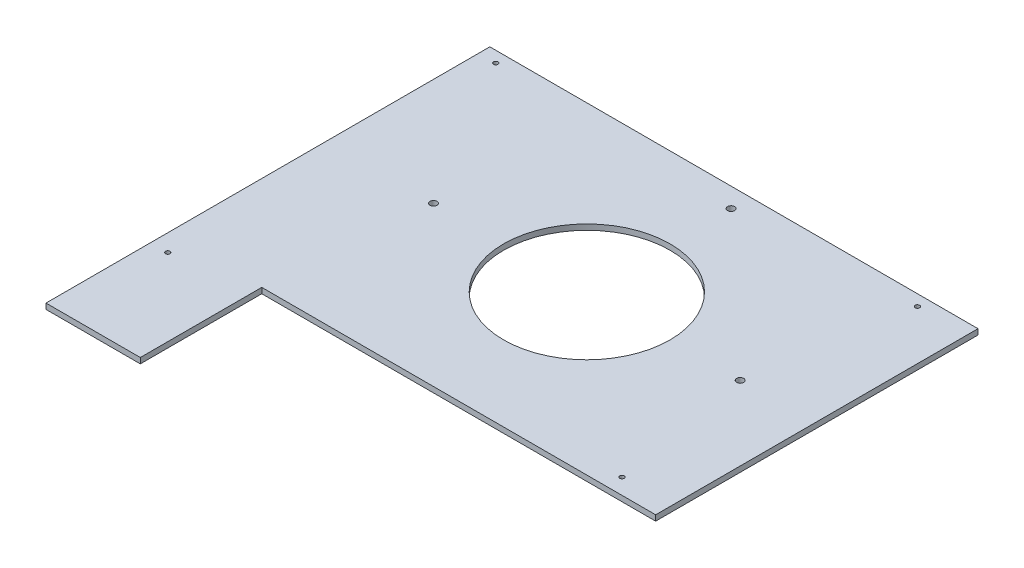
ISO-10303-21;
HEADER;
FILE_DESCRIPTION(('STEP AP214'),'2;1');
FILE_NAME('part.step','',(''),(''),'','','');
FILE_SCHEMA(('AUTOMOTIVE_DESIGN { 1 0 10303 214 1 1 1 1 }'));
ENDSEC;
DATA;
#1=APPLICATION_CONTEXT('core data for automotive mechanical design processes');
#2=APPLICATION_PROTOCOL_DEFINITION('international standard','automotive_design',2000,#1);
#3=PRODUCT_CONTEXT('',#1,'mechanical');
#4=PRODUCT('Part','Part','',(#3));
#5=PRODUCT_RELATED_PRODUCT_CATEGORY('part','',(#4));
#6=PRODUCT_DEFINITION_FORMATION('','',#4);
#7=PRODUCT_DEFINITION_CONTEXT('part definition',#1,'design');
#8=PRODUCT_DEFINITION('design','',#6,#7);
#9=PRODUCT_DEFINITION_SHAPE('','',#8);
#10=(LENGTH_UNIT() NAMED_UNIT(*) SI_UNIT(.MILLI.,.METRE.));
#11=(NAMED_UNIT(*) PLANE_ANGLE_UNIT() SI_UNIT($,.RADIAN.));
#12=(NAMED_UNIT(*) SI_UNIT($,.STERADIAN.) SOLID_ANGLE_UNIT());
#13=UNCERTAINTY_MEASURE_WITH_UNIT(LENGTH_MEASURE(1.E-05),#10,'distance_accuracy_value','');
#14=(GEOMETRIC_REPRESENTATION_CONTEXT(3) GLOBAL_UNCERTAINTY_ASSIGNED_CONTEXT((#13)) GLOBAL_UNIT_ASSIGNED_CONTEXT((#10,
#11,#12)) REPRESENTATION_CONTEXT('',''));
#15=CARTESIAN_POINT('',(0.,0.,0.));
#16=DIRECTION('',(0.,0.,1.));
#17=DIRECTION('',(1.,0.,0.));
#18=AXIS2_PLACEMENT_3D('',#15,#16,#17);
#19=CARTESIAN_POINT('',(0.,5.,0.));
#20=DIRECTION('',(0.,-1.,0.));
#21=DIRECTION('',(0.,0.,-1.));
#22=AXIS2_PLACEMENT_3D('',#19,#20,#21);
#23=PLANE('',#22);
#24=DIRECTION('',(1.,0.,0.));
#25=VECTOR('',#24,1.);
#26=CARTESIAN_POINT('',(-79.0240692738557,5.,112.958468136333));
#27=LINE('',#26,#25);
#28=CARTESIAN_POINT('',(-79.0240692738557,5.,112.958468136333));
#29=VERTEX_POINT('',#28);
#30=CARTESIAN_POINT('',(275.975930726144,5.,112.958468136333));
#31=VERTEX_POINT('',#30);
#32=EDGE_CURVE('E132',#29,#31,#27,.T.);
#33=ORIENTED_EDGE('',*,*,#32,.T.);
#34=DIRECTION('',(0.,0.,-1.));
#35=VECTOR('',#34,1.);
#36=CARTESIAN_POINT('',(275.975930726144,5.,-177.56894216173));
#37=LINE('',#36,#35);
#38=CARTESIAN_POINT('',(275.975930726144,5.,-177.56894216173));
#39=VERTEX_POINT('',#38);
#40=EDGE_CURVE('E86',#31,#39,#37,.T.);
#41=ORIENTED_EDGE('',*,*,#40,.T.);
#42=DIRECTION('',(-1.,0.,0.));
#43=VECTOR('',#42,1.);
#44=CARTESIAN_POINT('',(275.975930726144,5.,-177.56894216173));
#45=LINE('',#44,#43);
#46=CARTESIAN_POINT('',(-164.024069273856,5.,-177.56894216173));
#47=VERTEX_POINT('',#46);
#48=EDGE_CURVE('E100',#39,#47,#45,.T.);
#49=ORIENTED_EDGE('',*,*,#48,.T.);
#50=DIRECTION('',(0.,0.,1.));
#51=VECTOR('',#50,1.);
#52=CARTESIAN_POINT('',(-164.024069273856,5.,-177.56894216173));
#53=LINE('',#52,#51);
#54=CARTESIAN_POINT('',(-164.024069273856,5.,222.426710105648));
#55=VERTEX_POINT('',#54);
#56=EDGE_CURVE('E93',#47,#55,#53,.T.);
#57=ORIENTED_EDGE('',*,*,#56,.T.);
#58=DIRECTION('',(1.,0.,0.));
#59=VECTOR('',#58,1.);
#60=CARTESIAN_POINT('',(-164.024069273856,5.,222.426710105648));
#61=LINE('',#60,#59);
#62=CARTESIAN_POINT('',(-79.0240692738557,5.,222.426710105648));
#63=VERTEX_POINT('',#62);
#64=EDGE_CURVE('E97',#55,#63,#61,.T.);
#65=ORIENTED_EDGE('',*,*,#64,.T.);
#66=DIRECTION('',(0.,0.,-1.));
#67=VECTOR('',#66,1.);
#68=CARTESIAN_POINT('',(-79.0240692738557,5.,222.426710105648));
#69=LINE('',#68,#67);
#70=EDGE_CURVE('E51',#63,#29,#69,.T.);
#71=ORIENTED_EDGE('',*,*,#70,.T.);
#72=EDGE_LOOP('',(#33,#41,#49,#57,#65,#71));
#73=FACE_BOUND('',#72,.T.);
#74=CARTESIAN_POINT('',(-148.613055050861,5.,-167.56894216173));
#75=DIRECTION('',(0.,1.,0.));
#76=DIRECTION('',(0.,0.,1.));
#77=AXIS2_PLACEMENT_3D('',#74,#75,#76);
#78=CIRCLE('',#77,2.);
#79=CARTESIAN_POINT('',(-148.613055050861,5.,-165.56894216173));
#80=VERTEX_POINT('',#79);
#81=EDGE_CURVE('E123',#80,#80,#78,.T.);
#82=ORIENTED_EDGE('',*,*,#81,.F.);
#83=EDGE_LOOP('',(#82));
#84=FACE_BOUND('',#83,.T.);
#85=CARTESIAN_POINT('',(-148.613055050861,5.,128.145081947049));
#86=DIRECTION('',(0.,1.,0.));
#87=DIRECTION('',(0.,0.,1.));
#88=AXIS2_PLACEMENT_3D('',#85,#86,#87);
#89=CIRCLE('',#88,2.);
#90=CARTESIAN_POINT('',(-148.613055050861,5.,130.145081947049));
#91=VERTEX_POINT('',#90);
#92=EDGE_CURVE('E151',#91,#91,#89,.T.);
#93=ORIENTED_EDGE('',*,*,#92,.F.);
#94=EDGE_LOOP('',(#93));
#95=FACE_BOUND('',#94,.T.);
#96=CARTESIAN_POINT('',(231.386944949139,5.,98.6724922451126));
#97=DIRECTION('',(0.,1.,0.));
#98=DIRECTION('',(0.,0.,1.));
#99=AXIS2_PLACEMENT_3D('',#96,#97,#98);
#100=CIRCLE('',#99,2.);
#101=CARTESIAN_POINT('',(231.386944949139,5.,100.672492245113));
#102=VERTEX_POINT('',#101);
#103=EDGE_CURVE('E157',#102,#102,#100,.T.);
#104=ORIENTED_EDGE('',*,*,#103,.F.);
#105=EDGE_LOOP('',(#104));
#106=FACE_BOUND('',#105,.T.);
#107=CARTESIAN_POINT('',(231.386944949139,5.,-167.56894216173));
#108=DIRECTION('',(0.,1.,0.));
#109=DIRECTION('',(0.,0.,1.));
#110=AXIS2_PLACEMENT_3D('',#107,#108,#109);
#111=CIRCLE('',#110,2.);
#112=CARTESIAN_POINT('',(231.386944949139,5.,-165.56894216173));
#113=VERTEX_POINT('',#112);
#114=EDGE_CURVE('E163',#113,#113,#111,.T.);
#115=ORIENTED_EDGE('',*,*,#114,.F.);
#116=EDGE_LOOP('',(#115));
#117=FACE_BOUND('',#116,.T.);
#118=CARTESIAN_POINT('',(70.9759307261443,5.,-30.0257980897461));
#119=DIRECTION('',(0.,1.,0.));
#120=DIRECTION('',(0.,0.,1.));
#121=AXIS2_PLACEMENT_3D('',#118,#119,#120);
#122=CIRCLE('',#121,75.);
#123=CARTESIAN_POINT('',(70.9759307261443,5.,44.974201910254));
#124=VERTEX_POINT('',#123);
#125=EDGE_CURVE('E169',#124,#124,#122,.T.);
#126=ORIENTED_EDGE('',*,*,#125,.F.);
#127=EDGE_LOOP('',(#126));
#128=FACE_BOUND('',#127,.T.);
#129=CARTESIAN_POINT('',(70.9759307261443,5.,-160.025798089746));
#130=DIRECTION('',(0.,1.,0.));
#131=DIRECTION('',(0.,0.,1.));
#132=AXIS2_PLACEMENT_3D('',#129,#130,#131);
#133=CIRCLE('',#132,3.175);
#134=CARTESIAN_POINT('',(70.9759307261443,5.,-156.850798089746));
#135=VERTEX_POINT('',#134);
#136=EDGE_CURVE('E175',#135,#135,#133,.T.);
#137=ORIENTED_EDGE('',*,*,#136,.F.);
#138=EDGE_LOOP('',(#137));
#139=FACE_BOUND('',#138,.T.);
#140=CARTESIAN_POINT('',(209.175930726144,5.,-30.0257980897461));
#141=DIRECTION('',(0.,1.,0.));
#142=DIRECTION('',(0.,0.,1.));
#143=AXIS2_PLACEMENT_3D('',#140,#141,#142);
#144=CIRCLE('',#143,3.175);
#145=CARTESIAN_POINT('',(209.175930726144,5.,-26.8507980897461));
#146=VERTEX_POINT('',#145);
#147=EDGE_CURVE('E181',#146,#146,#144,.T.);
#148=ORIENTED_EDGE('',*,*,#147,.F.);
#149=EDGE_LOOP('',(#148));
#150=FACE_BOUND('',#149,.T.);
#151=CARTESIAN_POINT('',(-67.2240692738557,5.,-30.0257980897461));
#152=DIRECTION('',(0.,1.,0.));
#153=DIRECTION('',(0.,0.,1.));
#154=AXIS2_PLACEMENT_3D('',#151,#152,#153);
#155=CIRCLE('',#154,3.175);
#156=CARTESIAN_POINT('',(-67.2240692738557,5.,-26.8507980897461));
#157=VERTEX_POINT('',#156);
#158=EDGE_CURVE('E187',#157,#157,#155,.T.);
#159=ORIENTED_EDGE('',*,*,#158,.F.);
#160=EDGE_LOOP('',(#159));
#161=FACE_BOUND('',#160,.T.);
#162=ADVANCED_FACE('F34',(#73,#84,#95,#106,#117,#128,#139,#150,#161),#23,.F.);
#163=CARTESIAN_POINT('',(0.,0.,0.));
#164=DIRECTION('',(0.,-1.,0.));
#165=DIRECTION('',(0.,0.,-1.));
#166=AXIS2_PLACEMENT_3D('',#163,#164,#165);
#167=PLANE('',#166);
#168=CARTESIAN_POINT('',(209.175930726144,0.,-30.0257980897461));
#169=DIRECTION('',(0.,1.,0.));
#170=DIRECTION('',(0.,0.,1.));
#171=AXIS2_PLACEMENT_3D('',#168,#169,#170);
#172=CIRCLE('',#171,3.175);
#173=CARTESIAN_POINT('',(209.175930726144,0.,-26.8507980897461));
#174=VERTEX_POINT('',#173);
#175=EDGE_CURVE('E184',#174,#174,#172,.T.);
#176=ORIENTED_EDGE('',*,*,#175,.T.);
#177=EDGE_LOOP('',(#176));
#178=FACE_BOUND('',#177,.T.);
#179=CARTESIAN_POINT('',(70.9759307261443,0.,-30.0257980897461));
#180=DIRECTION('',(0.,1.,0.));
#181=DIRECTION('',(0.,0.,1.));
#182=AXIS2_PLACEMENT_3D('',#179,#180,#181);
#183=CIRCLE('',#182,75.);
#184=CARTESIAN_POINT('',(70.9759307261443,0.,44.974201910254));
#185=VERTEX_POINT('',#184);
#186=EDGE_CURVE('E172',#185,#185,#183,.T.);
#187=ORIENTED_EDGE('',*,*,#186,.T.);
#188=EDGE_LOOP('',(#187));
#189=FACE_BOUND('',#188,.T.);
#190=CARTESIAN_POINT('',(231.386944949139,0.,98.6724922451126));
#191=DIRECTION('',(0.,1.,0.));
#192=DIRECTION('',(0.,0.,1.));
#193=AXIS2_PLACEMENT_3D('',#190,#191,#192);
#194=CIRCLE('',#193,2.);
#195=CARTESIAN_POINT('',(231.386944949139,0.,100.672492245113));
#196=VERTEX_POINT('',#195);
#197=EDGE_CURVE('E160',#196,#196,#194,.T.);
#198=ORIENTED_EDGE('',*,*,#197,.T.);
#199=EDGE_LOOP('',(#198));
#200=FACE_BOUND('',#199,.T.);
#201=CARTESIAN_POINT('',(-148.613055050861,0.,-167.56894216173));
#202=DIRECTION('',(0.,1.,0.));
#203=DIRECTION('',(0.,0.,1.));
#204=AXIS2_PLACEMENT_3D('',#201,#202,#203);
#205=CIRCLE('',#204,2.);
#206=CARTESIAN_POINT('',(-148.613055050861,0.,-165.56894216173));
#207=VERTEX_POINT('',#206);
#208=EDGE_CURVE('E148',#207,#207,#205,.T.);
#209=ORIENTED_EDGE('',*,*,#208,.T.);
#210=EDGE_LOOP('',(#209));
#211=FACE_BOUND('',#210,.T.);
#212=DIRECTION('',(1.,0.,0.));
#213=VECTOR('',#212,1.);
#214=CARTESIAN_POINT('',(-79.0240692738557,0.,112.958468136333));
#215=LINE('',#214,#213);
#216=CARTESIAN_POINT('',(-79.0240692738557,0.,112.958468136333));
#217=VERTEX_POINT('',#216);
#218=CARTESIAN_POINT('',(275.975930726144,0.,112.958468136333));
#219=VERTEX_POINT('',#218);
#220=EDGE_CURVE('E119',#217,#219,#215,.T.);
#221=ORIENTED_EDGE('',*,*,#220,.F.);
#222=DIRECTION('',(0.,0.,-1.));
#223=VECTOR('',#222,1.);
#224=CARTESIAN_POINT('',(-79.0240692738557,0.,112.958468136333));
#225=LINE('',#224,#223);
#226=CARTESIAN_POINT('',(-79.0240692738557,0.,222.426710105648));
#227=VERTEX_POINT('',#226);
#228=EDGE_CURVE('E74',#227,#217,#225,.T.);
#229=ORIENTED_EDGE('',*,*,#228,.F.);
#230=DIRECTION('',(1.,0.,0.));
#231=VECTOR('',#230,1.);
#232=CARTESIAN_POINT('',(-164.024069273856,0.,222.426710105648));
#233=LINE('',#232,#231);
#234=CARTESIAN_POINT('',(-164.024069273856,0.,222.426710105648));
#235=VERTEX_POINT('',#234);
#236=EDGE_CURVE('E129',#235,#227,#233,.T.);
#237=ORIENTED_EDGE('',*,*,#236,.F.);
#238=DIRECTION('',(0.,0.,1.));
#239=VECTOR('',#238,1.);
#240=CARTESIAN_POINT('',(-164.024069273856,0.,189.256710105648));
#241=LINE('',#240,#239);
#242=CARTESIAN_POINT('',(-164.024069273856,0.,-177.56894216173));
#243=VERTEX_POINT('',#242);
#244=EDGE_CURVE('E108',#243,#235,#241,.T.);
#245=ORIENTED_EDGE('',*,*,#244,.F.);
#246=DIRECTION('',(-1.,0.,0.));
#247=VECTOR('',#246,1.);
#248=CARTESIAN_POINT('',(275.975930726144,0.,-177.56894216173));
#249=LINE('',#248,#247);
#250=CARTESIAN_POINT('',(275.975930726144,0.,-177.56894216173));
#251=VERTEX_POINT('',#250);
#252=EDGE_CURVE('E125',#251,#243,#249,.T.);
#253=ORIENTED_EDGE('',*,*,#252,.F.);
#254=DIRECTION('',(0.,0.,-1.));
#255=VECTOR('',#254,1.);
#256=CARTESIAN_POINT('',(275.975930726144,0.,-177.56894216173));
#257=LINE('',#256,#255);
#258=EDGE_CURVE('E122',#219,#251,#257,.T.);
#259=ORIENTED_EDGE('',*,*,#258,.F.);
#260=EDGE_LOOP('',(#221,#229,#237,#245,#253,#259));
#261=FACE_BOUND('',#260,.T.);
#262=CARTESIAN_POINT('',(-148.613055050861,0.,128.145081947049));
#263=DIRECTION('',(0.,1.,0.));
#264=DIRECTION('',(0.,0.,1.));
#265=AXIS2_PLACEMENT_3D('',#262,#263,#264);
#266=CIRCLE('',#265,2.);
#267=CARTESIAN_POINT('',(-148.613055050861,0.,130.145081947049));
#268=VERTEX_POINT('',#267);
#269=EDGE_CURVE('E154',#268,#268,#266,.T.);
#270=ORIENTED_EDGE('',*,*,#269,.T.);
#271=EDGE_LOOP('',(#270));
#272=FACE_BOUND('',#271,.T.);
#273=CARTESIAN_POINT('',(231.386944949139,0.,-167.56894216173));
#274=DIRECTION('',(0.,1.,0.));
#275=DIRECTION('',(0.,0.,1.));
#276=AXIS2_PLACEMENT_3D('',#273,#274,#275);
#277=CIRCLE('',#276,2.);
#278=CARTESIAN_POINT('',(231.386944949139,0.,-165.56894216173));
#279=VERTEX_POINT('',#278);
#280=EDGE_CURVE('E166',#279,#279,#277,.T.);
#281=ORIENTED_EDGE('',*,*,#280,.T.);
#282=EDGE_LOOP('',(#281));
#283=FACE_BOUND('',#282,.T.);
#284=CARTESIAN_POINT('',(70.9759307261443,0.,-160.025798089746));
#285=DIRECTION('',(0.,1.,0.));
#286=DIRECTION('',(0.,0.,1.));
#287=AXIS2_PLACEMENT_3D('',#284,#285,#286);
#288=CIRCLE('',#287,3.175);
#289=CARTESIAN_POINT('',(70.9759307261443,0.,-156.850798089746));
#290=VERTEX_POINT('',#289);
#291=EDGE_CURVE('E178',#290,#290,#288,.T.);
#292=ORIENTED_EDGE('',*,*,#291,.T.);
#293=EDGE_LOOP('',(#292));
#294=FACE_BOUND('',#293,.T.);
#295=CARTESIAN_POINT('',(-67.2240692738557,0.,-30.0257980897461));
#296=DIRECTION('',(0.,1.,0.));
#297=DIRECTION('',(0.,0.,1.));
#298=AXIS2_PLACEMENT_3D('',#295,#296,#297);
#299=CIRCLE('',#298,3.175);
#300=CARTESIAN_POINT('',(-67.2240692738557,0.,-26.8507980897461));
#301=VERTEX_POINT('',#300);
#302=EDGE_CURVE('E190',#301,#301,#299,.T.);
#303=ORIENTED_EDGE('',*,*,#302,.T.);
#304=EDGE_LOOP('',(#303));
#305=FACE_BOUND('',#304,.T.);
#306=ADVANCED_FACE('F139',(#178,#189,#200,#211,#261,#272,#283,#294,#305),#167,.T.);
#307=CARTESIAN_POINT('',(-79.0240692738557,5.,112.958468136333));
#308=DIRECTION('',(0.,0.,-1.));
#309=DIRECTION('',(-1.,0.,0.));
#310=AXIS2_PLACEMENT_3D('',#307,#308,#309);
#311=PLANE('',#310);
#312=ORIENTED_EDGE('',*,*,#220,.T.);
#313=DIRECTION('',(0.,-1.,0.));
#314=VECTOR('',#313,1.);
#315=CARTESIAN_POINT('',(275.975930726144,5.,112.958468136333));
#316=LINE('',#315,#314);
#317=EDGE_CURVE('E11',#31,#219,#316,.T.);
#318=ORIENTED_EDGE('',*,*,#317,.F.);
#319=ORIENTED_EDGE('',*,*,#32,.F.);
#320=DIRECTION('',(0.,-1.,0.));
#321=VECTOR('',#320,1.);
#322=CARTESIAN_POINT('',(-79.0240692738557,5.,112.958468136333));
#323=LINE('',#322,#321);
#324=EDGE_CURVE('E115',#29,#217,#323,.T.);
#325=ORIENTED_EDGE('',*,*,#324,.T.);
#326=EDGE_LOOP('',(#312,#318,#319,#325));
#327=FACE_BOUND('',#326,.T.);
#328=ADVANCED_FACE('F36',(#327),#311,.F.);
#329=CARTESIAN_POINT('',(275.975930726144,5.,-177.56894216173));
#330=DIRECTION('',(-1.,0.,0.));
#331=DIRECTION('',(0.,0.,1.));
#332=AXIS2_PLACEMENT_3D('',#329,#330,#331);
#333=PLANE('',#332);
#334=ORIENTED_EDGE('',*,*,#258,.T.);
#335=DIRECTION('',(0.,-1.,0.));
#336=VECTOR('',#335,1.);
#337=CARTESIAN_POINT('',(275.975930726144,5.,-177.56894216173));
#338=LINE('',#337,#336);
#339=EDGE_CURVE('E43',#39,#251,#338,.T.);
#340=ORIENTED_EDGE('',*,*,#339,.F.);
#341=ORIENTED_EDGE('',*,*,#40,.F.);
#342=ORIENTED_EDGE('',*,*,#317,.T.);
#343=EDGE_LOOP('',(#334,#340,#341,#342));
#344=FACE_BOUND('',#343,.T.);
#345=ADVANCED_FACE('F217',(#344),#333,.F.);
#346=CARTESIAN_POINT('',(275.975930726144,5.,-177.56894216173));
#347=DIRECTION('',(0.,0.,1.));
#348=DIRECTION('',(1.,0.,0.));
#349=AXIS2_PLACEMENT_3D('',#346,#347,#348);
#350=PLANE('',#349);
#351=ORIENTED_EDGE('',*,*,#252,.T.);
#352=DIRECTION('',(0.,-1.,0.));
#353=VECTOR('',#352,1.);
#354=CARTESIAN_POINT('',(-164.024069273856,5.,-177.56894216173));
#355=LINE('',#354,#353);
#356=EDGE_CURVE('E110',#47,#243,#355,.T.);
#357=ORIENTED_EDGE('',*,*,#356,.F.);
#358=ORIENTED_EDGE('',*,*,#48,.F.);
#359=ORIENTED_EDGE('',*,*,#339,.T.);
#360=EDGE_LOOP('',(#351,#357,#358,#359));
#361=FACE_BOUND('',#360,.T.);
#362=ADVANCED_FACE('F138',(#361),#350,.F.);
#363=CARTESIAN_POINT('',(-164.024069273856,5.,189.256710105648));
#364=DIRECTION('',(1.,0.,0.));
#365=DIRECTION('',(0.,0.,-1.));
#366=AXIS2_PLACEMENT_3D('',#363,#364,#365);
#367=PLANE('',#366);
#368=ORIENTED_EDGE('',*,*,#244,.T.);
#369=DIRECTION('',(0.,-1.,0.));
#370=VECTOR('',#369,1.);
#371=CARTESIAN_POINT('',(-164.024069273856,5.,222.426710105648));
#372=LINE('',#371,#370);
#373=EDGE_CURVE('E106',#55,#235,#372,.T.);
#374=ORIENTED_EDGE('',*,*,#373,.F.);
#375=ORIENTED_EDGE('',*,*,#56,.F.);
#376=ORIENTED_EDGE('',*,*,#356,.T.);
#377=EDGE_LOOP('',(#368,#374,#375,#376));
#378=FACE_BOUND('',#377,.T.);
#379=ADVANCED_FACE('F107',(#378),#367,.F.);
#380=CARTESIAN_POINT('',(-164.024069273856,5.,222.426710105648));
#381=DIRECTION('',(0.,0.,-1.));
#382=DIRECTION('',(-1.,0.,0.));
#383=AXIS2_PLACEMENT_3D('',#380,#381,#382);
#384=PLANE('',#383);
#385=ORIENTED_EDGE('',*,*,#236,.T.);
#386=DIRECTION('',(0.,-1.,0.));
#387=VECTOR('',#386,1.);
#388=CARTESIAN_POINT('',(-79.0240692738557,5.,222.426710105648));
#389=LINE('',#388,#387);
#390=EDGE_CURVE('E111',#63,#227,#389,.T.);
#391=ORIENTED_EDGE('',*,*,#390,.F.);
#392=ORIENTED_EDGE('',*,*,#64,.F.);
#393=ORIENTED_EDGE('',*,*,#373,.T.);
#394=EDGE_LOOP('',(#385,#391,#392,#393));
#395=FACE_BOUND('',#394,.T.);
#396=ADVANCED_FACE('F113',(#395),#384,.F.);
#397=CARTESIAN_POINT('',(-79.0240692738557,5.,112.958468136333));
#398=DIRECTION('',(-1.,0.,0.));
#399=DIRECTION('',(0.,0.,1.));
#400=AXIS2_PLACEMENT_3D('',#397,#398,#399);
#401=PLANE('',#400);
#402=ORIENTED_EDGE('',*,*,#228,.T.);
#403=ORIENTED_EDGE('',*,*,#324,.F.);
#404=ORIENTED_EDGE('',*,*,#70,.F.);
#405=ORIENTED_EDGE('',*,*,#390,.T.);
#406=EDGE_LOOP('',(#402,#403,#404,#405));
#407=FACE_BOUND('',#406,.T.);
#408=ADVANCED_FACE('F141',(#407),#401,.F.);
#409=CARTESIAN_POINT('',(-148.613055050861,5.,-167.56894216173));
#410=DIRECTION('',(0.,-1.,0.));
#411=DIRECTION('',(0.,0.,-1.));
#412=AXIS2_PLACEMENT_3D('',#409,#410,#411);
#413=CYLINDRICAL_SURFACE('',#412,2.);
#414=ORIENTED_EDGE('',*,*,#81,.T.);
#415=EDGE_LOOP('',(#414));
#416=FACE_BOUND('',#415,.T.);
#417=ORIENTED_EDGE('',*,*,#208,.F.);
#418=EDGE_LOOP('',(#417));
#419=FACE_BOUND('',#418,.T.);
#420=ADVANCED_FACE('F207',(#416,#419),#413,.F.);
#421=CARTESIAN_POINT('',(-148.613055050861,5.,128.145081947049));
#422=DIRECTION('',(0.,-1.,0.));
#423=DIRECTION('',(0.,0.,-1.));
#424=AXIS2_PLACEMENT_3D('',#421,#422,#423);
#425=CYLINDRICAL_SURFACE('',#424,2.);
#426=ORIENTED_EDGE('',*,*,#92,.T.);
#427=EDGE_LOOP('',(#426));
#428=FACE_BOUND('',#427,.T.);
#429=ORIENTED_EDGE('',*,*,#269,.F.);
#430=EDGE_LOOP('',(#429));
#431=FACE_BOUND('',#430,.T.);
#432=ADVANCED_FACE('F281',(#428,#431),#425,.F.);
#433=CARTESIAN_POINT('',(231.386944949139,5.,98.6724922451126));
#434=DIRECTION('',(0.,-1.,0.));
#435=DIRECTION('',(0.,0.,-1.));
#436=AXIS2_PLACEMENT_3D('',#433,#434,#435);
#437=CYLINDRICAL_SURFACE('',#436,2.);
#438=ORIENTED_EDGE('',*,*,#103,.T.);
#439=EDGE_LOOP('',(#438));
#440=FACE_BOUND('',#439,.T.);
#441=ORIENTED_EDGE('',*,*,#197,.F.);
#442=EDGE_LOOP('',(#441));
#443=FACE_BOUND('',#442,.T.);
#444=ADVANCED_FACE('F290',(#440,#443),#437,.F.);
#445=CARTESIAN_POINT('',(231.386944949139,5.,-167.56894216173));
#446=DIRECTION('',(0.,-1.,0.));
#447=DIRECTION('',(0.,0.,-1.));
#448=AXIS2_PLACEMENT_3D('',#445,#446,#447);
#449=CYLINDRICAL_SURFACE('',#448,2.);
#450=ORIENTED_EDGE('',*,*,#114,.T.);
#451=EDGE_LOOP('',(#450));
#452=FACE_BOUND('',#451,.T.);
#453=ORIENTED_EDGE('',*,*,#280,.F.);
#454=EDGE_LOOP('',(#453));
#455=FACE_BOUND('',#454,.T.);
#456=ADVANCED_FACE('F299',(#452,#455),#449,.F.);
#457=CARTESIAN_POINT('',(70.9759307261443,5.,-30.0257980897461));
#458=DIRECTION('',(0.,-1.,0.));
#459=DIRECTION('',(0.,0.,-1.));
#460=AXIS2_PLACEMENT_3D('',#457,#458,#459);
#461=CYLINDRICAL_SURFACE('',#460,75.);
#462=ORIENTED_EDGE('',*,*,#125,.T.);
#463=EDGE_LOOP('',(#462));
#464=FACE_BOUND('',#463,.T.);
#465=ORIENTED_EDGE('',*,*,#186,.F.);
#466=EDGE_LOOP('',(#465));
#467=FACE_BOUND('',#466,.T.);
#468=ADVANCED_FACE('F309',(#464,#467),#461,.F.);
#469=CARTESIAN_POINT('',(70.9759307261443,5.,-160.025798089746));
#470=DIRECTION('',(0.,-1.,0.));
#471=DIRECTION('',(0.,0.,-1.));
#472=AXIS2_PLACEMENT_3D('',#469,#470,#471);
#473=CYLINDRICAL_SURFACE('',#472,3.175);
#474=ORIENTED_EDGE('',*,*,#136,.T.);
#475=EDGE_LOOP('',(#474));
#476=FACE_BOUND('',#475,.T.);
#477=ORIENTED_EDGE('',*,*,#291,.F.);
#478=EDGE_LOOP('',(#477));
#479=FACE_BOUND('',#478,.T.);
#480=ADVANCED_FACE('F319',(#476,#479),#473,.F.);
#481=CARTESIAN_POINT('',(209.175930726144,5.,-30.0257980897461));
#482=DIRECTION('',(0.,-1.,0.));
#483=DIRECTION('',(0.,0.,-1.));
#484=AXIS2_PLACEMENT_3D('',#481,#482,#483);
#485=CYLINDRICAL_SURFACE('',#484,3.175);
#486=ORIENTED_EDGE('',*,*,#147,.T.);
#487=EDGE_LOOP('',(#486));
#488=FACE_BOUND('',#487,.T.);
#489=ORIENTED_EDGE('',*,*,#175,.F.);
#490=EDGE_LOOP('',(#489));
#491=FACE_BOUND('',#490,.T.);
#492=ADVANCED_FACE('F329',(#488,#491),#485,.F.);
#493=CARTESIAN_POINT('',(-67.2240692738557,5.,-30.0257980897461));
#494=DIRECTION('',(0.,-1.,0.));
#495=DIRECTION('',(0.,0.,-1.));
#496=AXIS2_PLACEMENT_3D('',#493,#494,#495);
#497=CYLINDRICAL_SURFACE('',#496,3.175);
#498=ORIENTED_EDGE('',*,*,#158,.T.);
#499=EDGE_LOOP('',(#498));
#500=FACE_BOUND('',#499,.T.);
#501=ORIENTED_EDGE('',*,*,#302,.F.);
#502=EDGE_LOOP('',(#501));
#503=FACE_BOUND('',#502,.T.);
#504=ADVANCED_FACE('F196',(#500,#503),#497,.F.);
#505=CLOSED_SHELL('',(#162,#306,#328,#345,#362,#379,#396,#408,#420,#432,#444,#456,#468,#480,
#492,#504));
#506=MANIFOLD_SOLID_BREP('B2',#505);
#507=ADVANCED_BREP_SHAPE_REPRESENTATION('',(#18,#506),#14);
#508=SHAPE_DEFINITION_REPRESENTATION(#9,#507);
ENDSEC;
END-ISO-10303-21;
